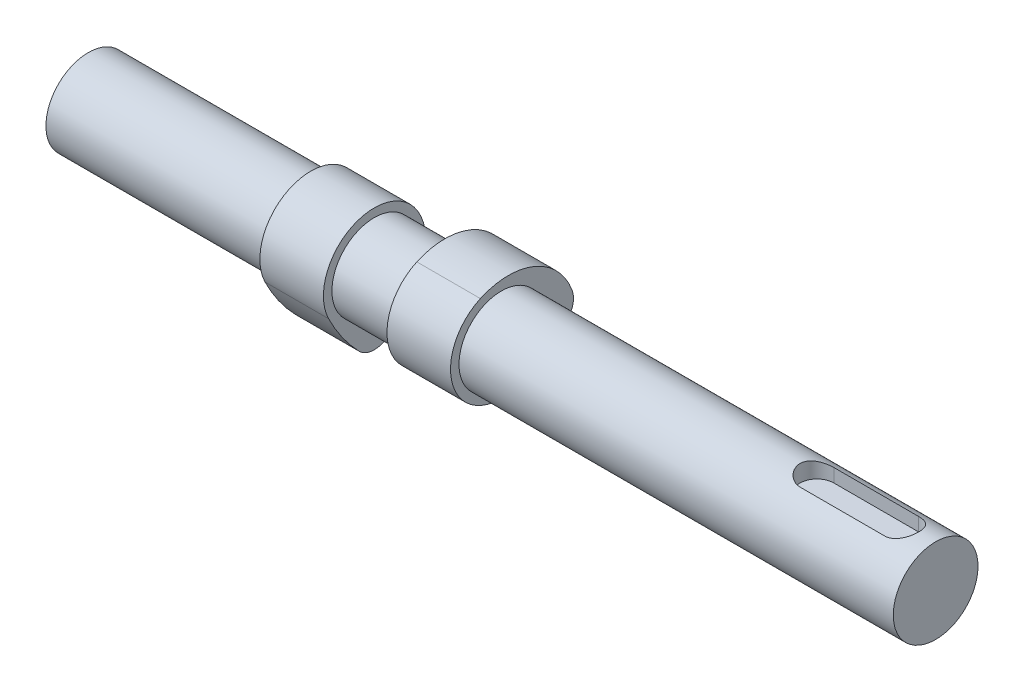
ISO-10303-21;
HEADER;
FILE_DESCRIPTION(('STEP AP214'),'2;1');
FILE_NAME('part.step','',(''),(''),'','','');
FILE_SCHEMA(('AUTOMOTIVE_DESIGN { 1 0 10303 214 1 1 1 1 }'));
ENDSEC;
DATA;
#1=APPLICATION_CONTEXT('core data for automotive mechanical design processes');
#2=APPLICATION_PROTOCOL_DEFINITION('international standard','automotive_design',2000,#1);
#3=PRODUCT_CONTEXT('',#1,'mechanical');
#4=PRODUCT('Part','Part','',(#3));
#5=PRODUCT_RELATED_PRODUCT_CATEGORY('part','',(#4));
#6=PRODUCT_DEFINITION_FORMATION('','',#4);
#7=PRODUCT_DEFINITION_CONTEXT('part definition',#1,'design');
#8=PRODUCT_DEFINITION('design','',#6,#7);
#9=PRODUCT_DEFINITION_SHAPE('','',#8);
#10=(LENGTH_UNIT() NAMED_UNIT(*) SI_UNIT(.MILLI.,.METRE.));
#11=(NAMED_UNIT(*) PLANE_ANGLE_UNIT() SI_UNIT($,.RADIAN.));
#12=(NAMED_UNIT(*) SI_UNIT($,.STERADIAN.) SOLID_ANGLE_UNIT());
#13=UNCERTAINTY_MEASURE_WITH_UNIT(LENGTH_MEASURE(1.E-05),#10,'distance_accuracy_value','');
#14=(GEOMETRIC_REPRESENTATION_CONTEXT(3) GLOBAL_UNCERTAINTY_ASSIGNED_CONTEXT((#13)) GLOBAL_UNIT_ASSIGNED_CONTEXT((#10,
#11,#12)) REPRESENTATION_CONTEXT('',''));
#15=CARTESIAN_POINT('',(0.,0.,0.));
#16=DIRECTION('',(0.,0.,1.));
#17=DIRECTION('',(1.,0.,0.));
#18=AXIS2_PLACEMENT_3D('',#15,#16,#17);
#19=CARTESIAN_POINT('',(-22.5,12.3156721801937,-25.1460577178611));
#20=DIRECTION('',(1.,0.,0.));
#21=DIRECTION('',(0.,1.,0.));
#22=AXIS2_PLACEMENT_3D('',#19,#20,#21);
#23=CYLINDRICAL_SURFACE('',#22,40.);
#24=CARTESIAN_POINT('',(-7.5,12.3156721801937,-25.1460577178611));
#25=DIRECTION('',(1.,0.,0.));
#26=DIRECTION('',(0.,-1.,0.));
#27=AXIS2_PLACEMENT_3D('',#24,#25,#26);
#28=CIRCLE('',#27,40.);
#29=CARTESIAN_POINT('',(-7.5,-5.27814522008302,10.7768818790833));
#30=VERTEX_POINT('',#29);
#31=CARTESIAN_POINT('',(-7.5,-15.5071088248952,3.59229395969449));
#32=VERTEX_POINT('',#31);
#33=EDGE_CURVE('E108',#30,#32,#28,.T.);
#34=ORIENTED_EDGE('',*,*,#33,.F.);
#35=DIRECTION('',(1.,0.,0.));
#36=VECTOR('',#35,1.);
#37=CARTESIAN_POINT('',(-22.5,-5.27814522008302,10.7768818790833));
#38=LINE('',#37,#36);
#39=CARTESIAN_POINT('',(-22.5,-5.27814522008302,10.7768818790833));
#40=VERTEX_POINT('',#39);
#41=EDGE_CURVE('E107',#40,#30,#38,.T.);
#42=ORIENTED_EDGE('',*,*,#41,.F.);
#43=CARTESIAN_POINT('',(-22.5,12.3156721801937,-25.1460577178611));
#44=DIRECTION('',(1.,0.,0.));
#45=DIRECTION('',(0.,-1.,0.));
#46=AXIS2_PLACEMENT_3D('',#43,#44,#45);
#47=CIRCLE('',#46,40.);
#48=CARTESIAN_POINT('',(-22.5,-15.5071088248952,3.59229395969449));
#49=VERTEX_POINT('',#48);
#50=EDGE_CURVE('E102',#40,#49,#47,.T.);
#51=ORIENTED_EDGE('',*,*,#50,.T.);
#52=DIRECTION('',(1.,0.,0.));
#53=VECTOR('',#52,1.);
#54=CARTESIAN_POINT('',(-22.5,-15.5071088248952,3.59229395969449));
#55=LINE('',#54,#53);
#56=EDGE_CURVE('E12',#49,#32,#55,.T.);
#57=ORIENTED_EDGE('',*,*,#56,.T.);
#58=EDGE_LOOP('',(#34,#42,#51,#57));
#59=FACE_BOUND('',#58,.T.);
#60=ADVANCED_FACE('F45',(#59),#23,.T.);
#61=CARTESIAN_POINT('',(-22.5,-12.0292611992591,0.));
#62=DIRECTION('',(1.,0.,0.));
#63=DIRECTION('',(0.,1.,0.));
#64=AXIS2_PLACEMENT_3D('',#61,#62,#63);
#65=CYLINDRICAL_SURFACE('',#64,5.);
#66=CARTESIAN_POINT('',(-7.5,-12.0292611992591,0.));
#67=DIRECTION('',(1.,0.,0.));
#68=DIRECTION('',(0.,-1.,0.));
#69=AXIS2_PLACEMENT_3D('',#66,#67,#68);
#70=CIRCLE('',#69,5.);
#71=CARTESIAN_POINT('',(-7.5,-16.7469832012361,-1.65623039220453));
#72=VERTEX_POINT('',#71);
#73=EDGE_CURVE('E110',#32,#72,#70,.T.);
#74=ORIENTED_EDGE('',*,*,#73,.F.);
#75=ORIENTED_EDGE('',*,*,#56,.F.);
#76=CARTESIAN_POINT('',(-22.5,-12.0292611992591,0.));
#77=DIRECTION('',(1.,0.,0.));
#78=DIRECTION('',(0.,-1.,0.));
#79=AXIS2_PLACEMENT_3D('',#76,#77,#78);
#80=CIRCLE('',#79,5.);
#81=CARTESIAN_POINT('',(-22.5,-16.7469832012361,-1.65623039220453));
#82=VERTEX_POINT('',#81);
#83=EDGE_CURVE('E86',#49,#82,#80,.T.);
#84=ORIENTED_EDGE('',*,*,#83,.T.);
#85=DIRECTION('',(1.,0.,0.));
#86=VECTOR('',#85,1.);
#87=CARTESIAN_POINT('',(-22.5,-16.7469832012361,-1.65623039220453));
#88=LINE('',#87,#86);
#89=EDGE_CURVE('E53',#82,#72,#88,.T.);
#90=ORIENTED_EDGE('',*,*,#89,.T.);
#91=EDGE_LOOP('',(#74,#75,#84,#90));
#92=FACE_BOUND('',#91,.T.);
#93=ADVANCED_FACE('F100',(#92),#65,.T.);
#94=CARTESIAN_POINT('',(-22.5,-1.65027279490968,3.64370686285011));
#95=DIRECTION('',(1.,0.,0.));
#96=DIRECTION('',(0.,1.,0.));
#97=AXIS2_PLACEMENT_3D('',#94,#95,#96);
#98=CYLINDRICAL_SURFACE('',#97,16.);
#99=CARTESIAN_POINT('',(-7.5,-1.65027279490968,3.64370686285011));
#100=DIRECTION('',(1.,0.,0.));
#101=DIRECTION('',(0.,1.,0.));
#102=AXIS2_PLACEMENT_3D('',#99,#100,#101);
#103=CIRCLE('',#102,16.);
#104=CARTESIAN_POINT('',(-7.5,4.95081838472904,-10.9311205885503));
#105=VERTEX_POINT('',#104);
#106=EDGE_CURVE('E96',#72,#105,#103,.T.);
#107=ORIENTED_EDGE('',*,*,#106,.F.);
#108=ORIENTED_EDGE('',*,*,#89,.F.);
#109=CARTESIAN_POINT('',(-22.5,-1.65027279490968,3.64370686285011));
#110=DIRECTION('',(1.,0.,0.));
#111=DIRECTION('',(0.,1.,0.));
#112=AXIS2_PLACEMENT_3D('',#109,#110,#111);
#113=CIRCLE('',#112,16.);
#114=CARTESIAN_POINT('',(-22.5,4.95081838472904,-10.9311205885503));
#115=VERTEX_POINT('',#114);
#116=EDGE_CURVE('E89',#82,#115,#113,.T.);
#117=ORIENTED_EDGE('',*,*,#116,.T.);
#118=DIRECTION('',(1.,0.,0.));
#119=VECTOR('',#118,1.);
#120=CARTESIAN_POINT('',(-22.5,4.95081838472904,-10.9311205885503));
#121=LINE('',#120,#119);
#122=EDGE_CURVE('E99',#115,#105,#121,.T.);
#123=ORIENTED_EDGE('',*,*,#122,.T.);
#124=EDGE_LOOP('',(#107,#108,#117,#123));
#125=FACE_BOUND('',#124,.T.);
#126=ADVANCED_FACE('F95',(#125),#98,.T.);
#127=CARTESIAN_POINT('',(-22.5,0.,0.));
#128=DIRECTION('',(1.,0.,0.));
#129=DIRECTION('',(0.,1.,0.));
#130=AXIS2_PLACEMENT_3D('',#127,#128,#129);
#131=CYLINDRICAL_SURFACE('',#130,12.);
#132=CARTESIAN_POINT('',(-7.5,0.,0.));
#133=DIRECTION('',(1.,0.,0.));
#134=DIRECTION('',(0.,-1.,0.));
#135=AXIS2_PLACEMENT_3D('',#132,#133,#134);
#136=CIRCLE('',#135,12.);
#137=EDGE_CURVE('E75',#105,#30,#136,.T.);
#138=ORIENTED_EDGE('',*,*,#137,.F.);
#139=ORIENTED_EDGE('',*,*,#122,.F.);
#140=CARTESIAN_POINT('',(-22.5,0.,0.));
#141=DIRECTION('',(1.,0.,0.));
#142=DIRECTION('',(0.,-1.,0.));
#143=AXIS2_PLACEMENT_3D('',#140,#141,#142);
#144=CIRCLE('',#143,12.);
#145=EDGE_CURVE('E61',#115,#40,#144,.T.);
#146=ORIENTED_EDGE('',*,*,#145,.T.);
#147=ORIENTED_EDGE('',*,*,#41,.T.);
#148=EDGE_LOOP('',(#138,#139,#146,#147));
#149=FACE_BOUND('',#148,.T.);
#150=ADVANCED_FACE('F119',(#149),#131,.T.);
#151=CARTESIAN_POINT('',(-22.5,0.143205490467322,-12.5730288589305));
#152=DIRECTION('',(-1.,0.,0.));
#153=DIRECTION('',(0.,-1.,0.));
#154=AXIS2_PLACEMENT_3D('',#151,#152,#153);
#155=PLANE('',#154);
#156=ORIENTED_EDGE('',*,*,#50,.F.);
#157=ORIENTED_EDGE('',*,*,#145,.F.);
#158=ORIENTED_EDGE('',*,*,#116,.F.);
#159=ORIENTED_EDGE('',*,*,#83,.F.);
#160=EDGE_LOOP('',(#156,#157,#158,#159));
#161=FACE_BOUND('',#160,.T.);
#162=ADVANCED_FACE('F91',(#161),#155,.T.);
#163=CARTESIAN_POINT('',(-7.5,0.143205490467322,-12.5730288589305));
#164=DIRECTION('',(-1.,0.,0.));
#165=DIRECTION('',(0.,-1.,0.));
#166=AXIS2_PLACEMENT_3D('',#163,#164,#165);
#167=PLANE('',#166);
#168=ORIENTED_EDGE('',*,*,#33,.T.);
#169=ORIENTED_EDGE('',*,*,#73,.T.);
#170=ORIENTED_EDGE('',*,*,#106,.T.);
#171=ORIENTED_EDGE('',*,*,#137,.T.);
#172=EDGE_LOOP('',(#168,#169,#170,#171));
#173=FACE_BOUND('',#172,.T.);
#174=ADVANCED_FACE('F115',(#173),#167,.F.);
#175=CLOSED_SHELL('',(#60,#93,#126,#150,#162,#174));
#176=MANIFOLD_SOLID_BREP('B2',#175);
#177=CARTESIAN_POINT('',(22.5,25.1460577178611,12.3156721801938));
#178=DIRECTION('',(-1.,0.,0.));
#179=DIRECTION('',(0.,0.,1.));
#180=AXIS2_PLACEMENT_3D('',#177,#178,#179);
#181=CYLINDRICAL_SURFACE('',#180,40.);
#182=CARTESIAN_POINT('',(7.5,25.1460577178611,12.3156721801938));
#183=DIRECTION('',(1.,0.,0.));
#184=DIRECTION('',(0.,0.,-1.));
#185=AXIS2_PLACEMENT_3D('',#182,#183,#184);
#186=CIRCLE('',#185,40.);
#187=CARTESIAN_POINT('',(7.5,-10.7768818790833,-5.27814522008306));
#188=VERTEX_POINT('',#187);
#189=CARTESIAN_POINT('',(7.5,-3.59229395969444,-15.5071088248952));
#190=VERTEX_POINT('',#189);
#191=EDGE_CURVE('E240',#188,#190,#186,.T.);
#192=ORIENTED_EDGE('',*,*,#191,.T.);
#193=DIRECTION('',(-1.,0.,0.));
#194=VECTOR('',#193,1.);
#195=CARTESIAN_POINT('',(22.5,-3.59229395969444,-15.5071088248952));
#196=LINE('',#195,#194);
#197=CARTESIAN_POINT('',(22.5,-3.59229395969444,-15.5071088248952));
#198=VERTEX_POINT('',#197);
#199=EDGE_CURVE('E43',#198,#190,#196,.T.);
#200=ORIENTED_EDGE('',*,*,#199,.F.);
#201=CARTESIAN_POINT('',(22.5,25.1460577178611,12.3156721801938));
#202=DIRECTION('',(1.,0.,0.));
#203=DIRECTION('',(0.,0.,-1.));
#204=AXIS2_PLACEMENT_3D('',#201,#202,#203);
#205=CIRCLE('',#204,40.);
#206=CARTESIAN_POINT('',(22.5,-10.7768818790833,-5.27814522008306));
#207=VERTEX_POINT('',#206);
#208=EDGE_CURVE('E228',#207,#198,#205,.T.);
#209=ORIENTED_EDGE('',*,*,#208,.F.);
#210=DIRECTION('',(-1.,0.,0.));
#211=VECTOR('',#210,1.);
#212=CARTESIAN_POINT('',(22.5,-10.7768818790833,-5.27814522008306));
#213=LINE('',#212,#211);
#214=EDGE_CURVE('E236',#207,#188,#213,.T.);
#215=ORIENTED_EDGE('',*,*,#214,.T.);
#216=EDGE_LOOP('',(#192,#200,#209,#215));
#217=FACE_BOUND('',#216,.T.);
#218=ADVANCED_FACE('F177',(#217),#181,.T.);
#219=CARTESIAN_POINT('',(22.5,0.,-12.0292611992591));
#220=DIRECTION('',(-1.,0.,0.));
#221=DIRECTION('',(0.,0.,1.));
#222=AXIS2_PLACEMENT_3D('',#219,#220,#221);
#223=CYLINDRICAL_SURFACE('',#222,5.);
#224=CARTESIAN_POINT('',(7.5,0.,-12.0292611992591));
#225=DIRECTION('',(1.,0.,0.));
#226=DIRECTION('',(0.,0.,-1.));
#227=AXIS2_PLACEMENT_3D('',#224,#225,#226);
#228=CIRCLE('',#227,5.);
#229=CARTESIAN_POINT('',(7.5,1.65623039220459,-16.7469832012361));
#230=VERTEX_POINT('',#229);
#231=EDGE_CURVE('E232',#190,#230,#228,.T.);
#232=ORIENTED_EDGE('',*,*,#231,.T.);
#233=DIRECTION('',(-1.,0.,0.));
#234=VECTOR('',#233,1.);
#235=CARTESIAN_POINT('',(22.5,1.65623039220459,-16.7469832012361));
#236=LINE('',#235,#234);
#237=CARTESIAN_POINT('',(22.5,1.65623039220459,-16.7469832012361));
#238=VERTEX_POINT('',#237);
#239=EDGE_CURVE('E185',#238,#230,#236,.T.);
#240=ORIENTED_EDGE('',*,*,#239,.F.);
#241=CARTESIAN_POINT('',(22.5,0.,-12.0292611992591));
#242=DIRECTION('',(1.,0.,0.));
#243=DIRECTION('',(0.,0.,-1.));
#244=AXIS2_PLACEMENT_3D('',#241,#242,#243);
#245=CIRCLE('',#244,5.);
#246=EDGE_CURVE('E223',#198,#238,#245,.T.);
#247=ORIENTED_EDGE('',*,*,#246,.F.);
#248=ORIENTED_EDGE('',*,*,#199,.T.);
#249=EDGE_LOOP('',(#232,#240,#247,#248));
#250=FACE_BOUND('',#249,.T.);
#251=ADVANCED_FACE('F231',(#250),#223,.T.);
#252=CARTESIAN_POINT('',(22.5,-3.64370686285011,-1.65027279490969));
#253=DIRECTION('',(-1.,0.,0.));
#254=DIRECTION('',(0.,0.,1.));
#255=AXIS2_PLACEMENT_3D('',#252,#253,#254);
#256=CYLINDRICAL_SURFACE('',#255,16.);
#257=CARTESIAN_POINT('',(7.5,-3.64370686285011,-1.65027279490969));
#258=DIRECTION('',(1.,0.,0.));
#259=DIRECTION('',(0.,0.,1.));
#260=AXIS2_PLACEMENT_3D('',#257,#258,#259);
#261=CIRCLE('',#260,16.);
#262=CARTESIAN_POINT('',(7.5,10.9311205885503,4.95081838472907));
#263=VERTEX_POINT('',#262);
#264=EDGE_CURVE('E210',#230,#263,#261,.T.);
#265=ORIENTED_EDGE('',*,*,#264,.T.);
#266=DIRECTION('',(-1.,0.,0.));
#267=VECTOR('',#266,1.);
#268=CARTESIAN_POINT('',(22.5,10.9311205885503,4.95081838472907));
#269=LINE('',#268,#267);
#270=CARTESIAN_POINT('',(22.5,10.9311205885503,4.95081838472907));
#271=VERTEX_POINT('',#270);
#272=EDGE_CURVE('E233',#271,#263,#269,.T.);
#273=ORIENTED_EDGE('',*,*,#272,.F.);
#274=CARTESIAN_POINT('',(22.5,-3.64370686285011,-1.65027279490969));
#275=DIRECTION('',(1.,0.,0.));
#276=DIRECTION('',(0.,0.,1.));
#277=AXIS2_PLACEMENT_3D('',#274,#275,#276);
#278=CIRCLE('',#277,16.);
#279=EDGE_CURVE('E226',#238,#271,#278,.T.);
#280=ORIENTED_EDGE('',*,*,#279,.F.);
#281=ORIENTED_EDGE('',*,*,#239,.T.);
#282=EDGE_LOOP('',(#265,#273,#280,#281));
#283=FACE_BOUND('',#282,.T.);
#284=ADVANCED_FACE('F234',(#283),#256,.T.);
#285=CARTESIAN_POINT('',(22.5,0.,0.));
#286=DIRECTION('',(-1.,0.,0.));
#287=DIRECTION('',(0.,0.,1.));
#288=AXIS2_PLACEMENT_3D('',#285,#286,#287);
#289=CYLINDRICAL_SURFACE('',#288,12.);
#290=CARTESIAN_POINT('',(7.5,0.,0.));
#291=DIRECTION('',(1.,0.,0.));
#292=DIRECTION('',(0.,0.,-1.));
#293=AXIS2_PLACEMENT_3D('',#290,#291,#292);
#294=CIRCLE('',#293,12.);
#295=EDGE_CURVE('E216',#263,#188,#294,.T.);
#296=ORIENTED_EDGE('',*,*,#295,.T.);
#297=ORIENTED_EDGE('',*,*,#214,.F.);
#298=CARTESIAN_POINT('',(22.5,0.,0.));
#299=DIRECTION('',(1.,0.,0.));
#300=DIRECTION('',(0.,0.,-1.));
#301=AXIS2_PLACEMENT_3D('',#298,#299,#300);
#302=CIRCLE('',#301,12.);
#303=EDGE_CURVE('E193',#271,#207,#302,.T.);
#304=ORIENTED_EDGE('',*,*,#303,.F.);
#305=ORIENTED_EDGE('',*,*,#272,.T.);
#306=EDGE_LOOP('',(#296,#297,#304,#305));
#307=FACE_BOUND('',#306,.T.);
#308=ADVANCED_FACE('F247',(#307),#289,.T.);
#309=CARTESIAN_POINT('',(22.5,12.5730288589305,0.143205490467366));
#310=DIRECTION('',(1.,0.,0.));
#311=DIRECTION('',(0.,0.,-1.));
#312=AXIS2_PLACEMENT_3D('',#309,#310,#311);
#313=PLANE('',#312);
#314=ORIENTED_EDGE('',*,*,#208,.T.);
#315=ORIENTED_EDGE('',*,*,#246,.T.);
#316=ORIENTED_EDGE('',*,*,#279,.T.);
#317=ORIENTED_EDGE('',*,*,#303,.T.);
#318=EDGE_LOOP('',(#314,#315,#316,#317));
#319=FACE_BOUND('',#318,.T.);
#320=ADVANCED_FACE('F224',(#319),#313,.T.);
#321=CARTESIAN_POINT('',(7.5,12.5730288589305,0.143205490467366));
#322=DIRECTION('',(1.,0.,0.));
#323=DIRECTION('',(0.,0.,-1.));
#324=AXIS2_PLACEMENT_3D('',#321,#322,#323);
#325=PLANE('',#324);
#326=ORIENTED_EDGE('',*,*,#191,.F.);
#327=ORIENTED_EDGE('',*,*,#295,.F.);
#328=ORIENTED_EDGE('',*,*,#264,.F.);
#329=ORIENTED_EDGE('',*,*,#231,.F.);
#330=EDGE_LOOP('',(#326,#327,#328,#329));
#331=FACE_BOUND('',#330,.T.);
#332=ADVANCED_FACE('F250',(#331),#325,.F.);
#333=CLOSED_SHELL('',(#218,#251,#284,#308,#320,#332));
#334=MANIFOLD_SOLID_BREP('B6',#333);
#335=CARTESIAN_POINT('',(125.,0.,0.));
#336=DIRECTION('',(-1.,0.,0.));
#337=DIRECTION('',(0.,0.,1.));
#338=AXIS2_PLACEMENT_3D('',#335,#336,#337);
#339=CYLINDRICAL_SURFACE('',#338,10.);
#340=DIRECTION('',(-1.,0.,0.));
#341=VECTOR('',#340,1.);
#342=CARTESIAN_POINT('',(125.,9.16515138991168,-4.));
#343=LINE('',#342,#341);
#344=CARTESIAN_POINT('',(97.,9.16515138991168,-4.));
#345=VERTEX_POINT('',#344);
#346=CARTESIAN_POINT('',(117.,9.16515138991168,-4.));
#347=VERTEX_POINT('',#346);
#348=EDGE_CURVE('E175',#345,#347,#343,.F.);
#349=ORIENTED_EDGE('',*,*,#348,.T.);
#350=CARTESIAN_POINT('',(117.,9.16515138991168,-4.));
#351=CARTESIAN_POINT('',(117.107611705054,9.16512928809544,-4.00001596071938));
#352=CARTESIAN_POINT('',(117.215211331167,9.16704612011429,-3.99565782731266));
#353=CARTESIAN_POINT('',(117.429542596539,9.17459250745478,-3.9783181194646));
#354=CARTESIAN_POINT('',(117.536274550717,9.18022064873058,-3.96533982937531));
#355=CARTESIAN_POINT('',(117.747693643106,9.19499565865171,-3.93095207352899));
#356=CARTESIAN_POINT('',(117.852387168085,9.20412861441611,-3.90957593640916));
#357=CARTESIAN_POINT('',(118.059401543432,9.22560106586818,-3.85863260381273));
#358=CARTESIAN_POINT('',(118.161722248555,9.23794075728508,-3.82906490834148));
#359=CARTESIAN_POINT('',(118.463871701162,9.2791858250141,-3.72853943587112));
#360=CARTESIAN_POINT('',(118.659308461383,9.3123489831615,-3.64568978920222));
#361=CARTESIAN_POINT('',(119.033591160162,9.38624741529469,-3.45096383184148));
#362=CARTESIAN_POINT('',(119.212421105909,9.42698987727425,-3.33905992673095));
#363=CARTESIAN_POINT('',(119.558524793364,9.51401998804847,-3.08263671474507));
#364=CARTESIAN_POINT('',(119.7247344339,9.56048491272144,-2.93673827988501));
#365=CARTESIAN_POINT('',(120.031080544362,9.65225581096199,-2.61939292349378));
#366=CARTESIAN_POINT('',(120.171211661507,9.69756154495612,-2.44794076987998));
#367=CARTESIAN_POINT('',(120.426812788624,9.78406834216145,-2.07601181629753));
#368=CARTESIAN_POINT('',(120.54108961941,9.82503649102096,-1.87465586655103));
#369=CARTESIAN_POINT('',(120.733688144491,9.89607888234979,-1.45364828604453));
#370=CARTESIAN_POINT('',(120.812024844793,9.92615767032247,-1.23400433637532));
#371=CARTESIAN_POINT('',(120.926682405771,9.97076629361036,-0.793934884187379));
#372=CARTESIAN_POINT('',(120.964853913303,9.98597845290694,-0.574062114869029));
#373=CARTESIAN_POINT('',(121.004056948403,10.001606202074,-0.13053685509221));
#374=CARTESIAN_POINT('',(121.005101633252,10.0020270338048,0.0931142682526735));
#375=CARTESIAN_POINT('',(120.971034362072,9.98843920775428,0.524466731987228));
#376=CARTESIAN_POINT('',(120.937950053447,9.97523973659777,0.73235833063275));
#377=CARTESIAN_POINT('',(120.84001299909,9.93698538393897,1.13934964738688));
#378=CARTESIAN_POINT('',(120.77515845543,9.91192983148495,1.33844886722558));
#379=CARTESIAN_POINT('',(120.614727962228,9.85193670608706,1.72579479688348));
#380=CARTESIAN_POINT('',(120.518703604161,9.81685584875391,1.9138326458689));
#381=CARTESIAN_POINT('',(120.299068736295,9.74029168639969,2.2716159956307));
#382=CARTESIAN_POINT('',(120.175448548562,9.69880613681324,2.44135504792269));
#383=CARTESIAN_POINT('',(119.894719942564,9.61043706268122,2.7695225783069));
#384=CARTESIAN_POINT('',(119.735946982884,9.5633779574542,2.92647922614482));
#385=CARTESIAN_POINT('',(119.394007863337,9.47123359153047,3.21221470862619));
#386=CARTESIAN_POINT('',(119.2108306512,9.42614923753061,3.34098070594788));
#387=CARTESIAN_POINT('',(118.918364354377,9.36326134539255,3.51186134851388));
#388=CARTESIAN_POINT('',(118.816328161685,9.34283170142195,3.56571263251514));
#389=CARTESIAN_POINT('',(118.607607697591,9.30450957703985,3.66454761505658));
#390=CARTESIAN_POINT('',(118.500925454273,9.28661600381594,3.70953513634085));
#391=CARTESIAN_POINT('',(118.283771069504,9.25400250539921,3.79016254319007));
#392=CARTESIAN_POINT('',(118.173303829959,9.23927864276951,3.82581403809398));
#393=CARTESIAN_POINT('',(117.949331631851,9.2135146773091,3.88744848158463));
#394=CARTESIAN_POINT('',(117.835828059787,9.20247292309662,3.91343576505911));
#395=CARTESIAN_POINT('',(117.602554552662,9.18417798205495,3.95619393609845));
#396=CARTESIAN_POINT('',(117.482705805436,9.17707470750587,3.97260125584169));
#397=CARTESIAN_POINT('',(117.241909070863,9.16754485606458,3.99451448409732));
#398=CARTESIAN_POINT('',(117.120961807077,9.16511539745838,4.0000271099601));
#399=CARTESIAN_POINT('',(117.,9.16515138991168,4.));
#400=B_SPLINE_CURVE_WITH_KNOTS('',3,(#350,#351,#352,#353,#354,#355,#356,#357,#358,#359,#360,
#361,#362,#363,#364,#365,#366,#367,#368,#369,#370,#371,#372,#373,#374,#375,#376,#377,#378,#379,
#380,#381,#382,#383,#384,#385,#386,#387,#388,#389,#390,#391,#392,#393,#394,#395,#396,#397,#398,
#399),.UNSPECIFIED.,.F.,.F.,(4,2,2,2,2,2,2,2,2,2,2,2,2,2,2,2,2,2,2,2,2,2,2,2,4),(0.,
0.322709706217834,0.645296527806424,0.966615822543774,1.28795473422461,1.92936600351818,
2.5713886988925,3.24636095994996,3.92147161082383,4.62325717855527,5.32474946398645,
5.99227753012539,6.65956903033311,7.2893783052307,7.91922322615309,8.55856353859093,
9.19812842270037,9.87963749353242,10.5614562641081,10.9125878460839,11.2635676597187,
11.6141089352909,11.964492785171,12.3274303244848,12.6901440171997),.UNSPECIFIED.);
#401=CARTESIAN_POINT('',(117.,9.16515138991168,4.));
#402=VERTEX_POINT('',#401);
#403=EDGE_CURVE('E376',#347,#402,#400,.T.);
#404=ORIENTED_EDGE('',*,*,#403,.T.);
#405=DIRECTION('',(-1.,0.,0.));
#406=VECTOR('',#405,1.);
#407=CARTESIAN_POINT('',(125.,9.16515138991168,4.));
#408=LINE('',#407,#406);
#409=CARTESIAN_POINT('',(97.,9.16515138991168,4.));
#410=VERTEX_POINT('',#409);
#411=EDGE_CURVE('E309',#402,#410,#408,.T.);
#412=ORIENTED_EDGE('',*,*,#411,.T.);
#413=CARTESIAN_POINT('',(97.,9.16515138991168,4.));
#414=CARTESIAN_POINT('',(96.8923882949458,9.16512928809544,4.00001596071938));
#415=CARTESIAN_POINT('',(96.7847886688333,9.16704612011428,3.99565782731266));
#416=CARTESIAN_POINT('',(96.5704574034612,9.17459250745478,3.9783181194646));
#417=CARTESIAN_POINT('',(96.4637254492831,9.18022064873058,3.96533982937531));
#418=CARTESIAN_POINT('',(96.2523063568937,9.19499565865171,3.93095207352899));
#419=CARTESIAN_POINT('',(96.1476128319149,9.20412861441611,3.90957593640916));
#420=CARTESIAN_POINT('',(95.9405984565681,9.22560106586818,3.85863260381273));
#421=CARTESIAN_POINT('',(95.8382777514449,9.23794075728508,3.82906490834148));
#422=CARTESIAN_POINT('',(95.5361282988375,9.2791858250141,3.72853943587112));
#423=CARTESIAN_POINT('',(95.3406915386172,9.3123489831615,3.64568978920222));
#424=CARTESIAN_POINT('',(94.9664088398381,9.38624741529469,3.45096383184147));
#425=CARTESIAN_POINT('',(94.7875788940914,9.42698987727426,3.33905992673094));
#426=CARTESIAN_POINT('',(94.441475206636,9.51401998804847,3.08263671474506));
#427=CARTESIAN_POINT('',(94.2752655660996,9.56048491272144,2.936738279885));
#428=CARTESIAN_POINT('',(93.9689194556385,9.65225581096199,2.61939292349377));
#429=CARTESIAN_POINT('',(93.8287883384928,9.69756154495612,2.44794076987997));
#430=CARTESIAN_POINT('',(93.5731872113755,9.78406834216145,2.07601181629752));
#431=CARTESIAN_POINT('',(93.4589103805898,9.82503649102096,1.87465586655101));
#432=CARTESIAN_POINT('',(93.2663118555086,9.89607888234979,1.45364828604451));
#433=CARTESIAN_POINT('',(93.1879751552067,9.92615767032247,1.2340043363753));
#434=CARTESIAN_POINT('',(93.0733175942291,9.97076629361036,0.793934884187358));
#435=CARTESIAN_POINT('',(93.0351460866968,9.98597845290694,0.57406211486901));
#436=CARTESIAN_POINT('',(92.9959430515965,10.001606202074,0.130536855092195));
#437=CARTESIAN_POINT('',(92.9948983667482,10.0020270338048,-0.0931142682526866));
#438=CARTESIAN_POINT('',(93.0289656379282,9.98843920775428,-0.524466731987239));
#439=CARTESIAN_POINT('',(93.0620499465532,9.97523973659776,-0.73235833063276));
#440=CARTESIAN_POINT('',(93.1599870009102,9.93698538393897,-1.13934964738689));
#441=CARTESIAN_POINT('',(93.2248415445704,9.91192983148495,-1.33844886722559));
#442=CARTESIAN_POINT('',(93.3852720377719,9.85193670608706,-1.7257947968835));
#443=CARTESIAN_POINT('',(93.481296395839,9.81685584875391,-1.91383264586892));
#444=CARTESIAN_POINT('',(93.7009312637048,9.74029168639969,-2.27161599563072));
#445=CARTESIAN_POINT('',(93.8245514514379,9.69880613681324,-2.44135504792271));
#446=CARTESIAN_POINT('',(94.1052800574364,9.61043706268122,-2.76952257830691));
#447=CARTESIAN_POINT('',(94.2640530171164,9.56337795745419,-2.92647922614484));
#448=CARTESIAN_POINT('',(94.6059921366628,9.47123359153046,-3.21221470862621));
#449=CARTESIAN_POINT('',(94.7891693487996,9.42614923753061,-3.3409807059479));
#450=CARTESIAN_POINT('',(95.0816356456234,9.36326134539254,-3.5118613485139));
#451=CARTESIAN_POINT('',(95.1836718383149,9.34283170142194,-3.56571263251516));
#452=CARTESIAN_POINT('',(95.3923923024092,9.30450957703985,-3.66454761505659));
#453=CARTESIAN_POINT('',(95.4990745457273,9.28661600381593,-3.70953513634086));
#454=CARTESIAN_POINT('',(95.7162289304962,9.25400250539921,-3.79016254319007));
#455=CARTESIAN_POINT('',(95.8266961700413,9.2392786427695,-3.82581403809398));
#456=CARTESIAN_POINT('',(96.0506683681487,9.2135146773091,-3.88744848158464));
#457=CARTESIAN_POINT('',(96.1641719402126,9.20247292309662,-3.91343576505912));
#458=CARTESIAN_POINT('',(96.3974454473375,9.18417798205495,-3.95619393609845));
#459=CARTESIAN_POINT('',(96.5172941945638,9.17707470750587,-3.97260125584169));
#460=CARTESIAN_POINT('',(96.758090929137,9.16754485606458,-3.99451448409732));
#461=CARTESIAN_POINT('',(96.8790381929227,9.16511539745838,-4.0000271099601));
#462=CARTESIAN_POINT('',(97.,9.16515138991168,-4.));
#463=B_SPLINE_CURVE_WITH_KNOTS('',3,(#413,#414,#415,#416,#417,#418,#419,#420,#421,#422,#423,
#424,#425,#426,#427,#428,#429,#430,#431,#432,#433,#434,#435,#436,#437,#438,#439,#440,#441,#442,
#443,#444,#445,#446,#447,#448,#449,#450,#451,#452,#453,#454,#455,#456,#457,#458,#459,#460,#461,
#462),.UNSPECIFIED.,.F.,.F.,(4,2,2,2,2,2,2,2,2,2,2,2,2,2,2,2,2,2,2,2,2,2,2,2,4),(0.,
0.322709706217834,0.645296527806424,0.966615822543774,1.28795473422463,1.9293660035182,
2.57138869889252,3.24636095994996,3.92147161082383,4.62325717855529,5.32474946398647,
5.99227753012541,6.65956903033312,7.28937830523071,7.9192232261531,8.55856353859094,
9.1981284227004,9.87963749353247,10.5614562641081,10.9125878460839,11.2635676597187,
11.614108935291,11.964492785171,12.3274303244848,12.6901440171997),.UNSPECIFIED.);
#464=EDGE_CURVE('E316',#410,#345,#463,.T.);
#465=ORIENTED_EDGE('',*,*,#464,.T.);
#466=EDGE_LOOP('',(#349,#404,#412,#465));
#467=FACE_BOUND('',#466,.T.);
#468=CARTESIAN_POINT('',(125.,0.,0.));
#469=DIRECTION('',(1.,0.,0.));
#470=DIRECTION('',(0.,0.,-1.));
#471=AXIS2_PLACEMENT_3D('',#468,#469,#470);
#472=CIRCLE('',#471,10.);
#473=CARTESIAN_POINT('',(125.,0.,-10.));
#474=VERTEX_POINT('',#473);
#475=EDGE_CURVE('E373',#474,#474,#472,.T.);
#476=ORIENTED_EDGE('',*,*,#475,.F.);
#477=EDGE_LOOP('',(#476));
#478=FACE_BOUND('',#477,.T.);
#479=CARTESIAN_POINT('',(-75.,0.,0.));
#480=DIRECTION('',(1.,0.,0.));
#481=DIRECTION('',(0.,0.,-1.));
#482=AXIS2_PLACEMENT_3D('',#479,#480,#481);
#483=CIRCLE('',#482,10.);
#484=CARTESIAN_POINT('',(-75.,0.,-10.));
#485=VERTEX_POINT('',#484);
#486=EDGE_CURVE('E367',#485,#485,#483,.T.);
#487=ORIENTED_EDGE('',*,*,#486,.T.);
#488=EDGE_LOOP('',(#487));
#489=FACE_BOUND('',#488,.T.);
#490=ADVANCED_FACE('F301',(#467,#478,#489),#339,.T.);
#491=CARTESIAN_POINT('',(125.,0.,0.));
#492=DIRECTION('',(1.,0.,0.));
#493=DIRECTION('',(0.,0.,-1.));
#494=AXIS2_PLACEMENT_3D('',#491,#492,#493);
#495=PLANE('',#494);
#496=ORIENTED_EDGE('',*,*,#475,.T.);
#497=EDGE_LOOP('',(#496));
#498=FACE_BOUND('',#497,.T.);
#499=ADVANCED_FACE('F403',(#498),#495,.T.);
#500=CARTESIAN_POINT('',(-75.,0.,0.));
#501=DIRECTION('',(1.,0.,0.));
#502=DIRECTION('',(0.,0.,-1.));
#503=AXIS2_PLACEMENT_3D('',#500,#501,#502);
#504=PLANE('',#503);
#505=ORIENTED_EDGE('',*,*,#486,.F.);
#506=EDGE_LOOP('',(#505));
#507=FACE_BOUND('',#506,.T.);
#508=ADVANCED_FACE('F401',(#507),#504,.F.);
#509=CARTESIAN_POINT('',(97.,6.,0.));
#510=DIRECTION('',(0.,1.,0.));
#511=DIRECTION('',(0.,0.,1.));
#512=AXIS2_PLACEMENT_3D('',#509,#510,#511);
#513=CYLINDRICAL_SURFACE('',#512,4.);
#514=DIRECTION('',(0.,1.,0.));
#515=VECTOR('',#514,1.);
#516=CARTESIAN_POINT('',(97.,6.,4.));
#517=LINE('',#516,#515);
#518=CARTESIAN_POINT('',(97.,6.,4.));
#519=VERTEX_POINT('',#518);
#520=EDGE_CURVE('E339',#519,#410,#517,.T.);
#521=ORIENTED_EDGE('',*,*,#520,.F.);
#522=CARTESIAN_POINT('',(97.,6.,0.));
#523=DIRECTION('',(0.,1.,0.));
#524=DIRECTION('',(0.,0.,1.));
#525=AXIS2_PLACEMENT_3D('',#522,#523,#524);
#526=CIRCLE('',#525,4.);
#527=CARTESIAN_POINT('',(97.,6.,-4.));
#528=VERTEX_POINT('',#527);
#529=EDGE_CURVE('E343',#528,#519,#526,.T.);
#530=ORIENTED_EDGE('',*,*,#529,.F.);
#531=DIRECTION('',(0.,1.,0.));
#532=VECTOR('',#531,1.);
#533=CARTESIAN_POINT('',(97.,6.,-4.));
#534=LINE('',#533,#532);
#535=EDGE_CURVE('E365',#528,#345,#534,.T.);
#536=ORIENTED_EDGE('',*,*,#535,.T.);
#537=ORIENTED_EDGE('',*,*,#464,.F.);
#538=EDGE_LOOP('',(#521,#530,#536,#537));
#539=FACE_BOUND('',#538,.T.);
#540=ADVANCED_FACE('F341',(#539),#513,.F.);
#541=CARTESIAN_POINT('',(97.,6.,-4.));
#542=DIRECTION('',(0.,0.,-1.));
#543=DIRECTION('',(-1.,0.,0.));
#544=AXIS2_PLACEMENT_3D('',#541,#542,#543);
#545=PLANE('',#544);
#546=ORIENTED_EDGE('',*,*,#535,.F.);
#547=DIRECTION('',(-1.,0.,0.));
#548=VECTOR('',#547,1.);
#549=CARTESIAN_POINT('',(97.,6.,-4.));
#550=LINE('',#549,#548);
#551=CARTESIAN_POINT('',(117.,6.,-4.));
#552=VERTEX_POINT('',#551);
#553=EDGE_CURVE('E348',#552,#528,#550,.T.);
#554=ORIENTED_EDGE('',*,*,#553,.F.);
#555=DIRECTION('',(0.,1.,0.));
#556=VECTOR('',#555,1.);
#557=CARTESIAN_POINT('',(117.,6.,-4.));
#558=LINE('',#557,#556);
#559=EDGE_CURVE('E368',#552,#347,#558,.T.);
#560=ORIENTED_EDGE('',*,*,#559,.T.);
#561=ORIENTED_EDGE('',*,*,#348,.F.);
#562=EDGE_LOOP('',(#546,#554,#560,#561));
#563=FACE_BOUND('',#562,.T.);
#564=ADVANCED_FACE('F394',(#563),#545,.F.);
#565=CARTESIAN_POINT('',(117.,6.,0.));
#566=DIRECTION('',(0.,1.,0.));
#567=DIRECTION('',(0.,0.,1.));
#568=AXIS2_PLACEMENT_3D('',#565,#566,#567);
#569=CYLINDRICAL_SURFACE('',#568,4.);
#570=ORIENTED_EDGE('',*,*,#559,.F.);
#571=CARTESIAN_POINT('',(117.,6.,0.));
#572=DIRECTION('',(0.,1.,0.));
#573=DIRECTION('',(0.,0.,1.));
#574=AXIS2_PLACEMENT_3D('',#571,#572,#573);
#575=CIRCLE('',#574,4.);
#576=CARTESIAN_POINT('',(117.,6.,4.));
#577=VERTEX_POINT('',#576);
#578=EDGE_CURVE('E357',#577,#552,#575,.T.);
#579=ORIENTED_EDGE('',*,*,#578,.F.);
#580=DIRECTION('',(0.,1.,0.));
#581=VECTOR('',#580,1.);
#582=CARTESIAN_POINT('',(117.,6.,4.));
#583=LINE('',#582,#581);
#584=EDGE_CURVE('E347',#577,#402,#583,.T.);
#585=ORIENTED_EDGE('',*,*,#584,.T.);
#586=ORIENTED_EDGE('',*,*,#403,.F.);
#587=EDGE_LOOP('',(#570,#579,#585,#586));
#588=FACE_BOUND('',#587,.T.);
#589=ADVANCED_FACE('F389',(#588),#569,.F.);
#590=CARTESIAN_POINT('',(97.,6.,4.));
#591=DIRECTION('',(0.,0.,1.));
#592=DIRECTION('',(1.,0.,0.));
#593=AXIS2_PLACEMENT_3D('',#590,#591,#592);
#594=PLANE('',#593);
#595=ORIENTED_EDGE('',*,*,#584,.F.);
#596=DIRECTION('',(1.,0.,0.));
#597=VECTOR('',#596,1.);
#598=CARTESIAN_POINT('',(97.,6.,4.));
#599=LINE('',#598,#597);
#600=EDGE_CURVE('E351',#519,#577,#599,.T.);
#601=ORIENTED_EDGE('',*,*,#600,.F.);
#602=ORIENTED_EDGE('',*,*,#520,.T.);
#603=ORIENTED_EDGE('',*,*,#411,.F.);
#604=EDGE_LOOP('',(#595,#601,#602,#603));
#605=FACE_BOUND('',#604,.T.);
#606=ADVANCED_FACE('F352',(#605),#594,.F.);
#607=CARTESIAN_POINT('',(97.,6.,0.));
#608=DIRECTION('',(0.,1.,0.));
#609=DIRECTION('',(0.,0.,1.));
#610=AXIS2_PLACEMENT_3D('',#607,#608,#609);
#611=PLANE('',#610);
#612=ORIENTED_EDGE('',*,*,#529,.T.);
#613=ORIENTED_EDGE('',*,*,#600,.T.);
#614=ORIENTED_EDGE('',*,*,#578,.T.);
#615=ORIENTED_EDGE('',*,*,#553,.T.);
#616=EDGE_LOOP('',(#612,#613,#614,#615));
#617=FACE_BOUND('',#616,.T.);
#618=ADVANCED_FACE('F359',(#617),#611,.T.);
#619=CLOSED_SHELL('',(#490,#499,#508,#540,#564,#589,#606,#618));
#620=MANIFOLD_SOLID_BREP('B37',#619);
#621=ADVANCED_BREP_SHAPE_REPRESENTATION('',(#18,#176,#334,#620),#14);
#622=SHAPE_DEFINITION_REPRESENTATION(#9,#621);
ENDSEC;
END-ISO-10303-21;
